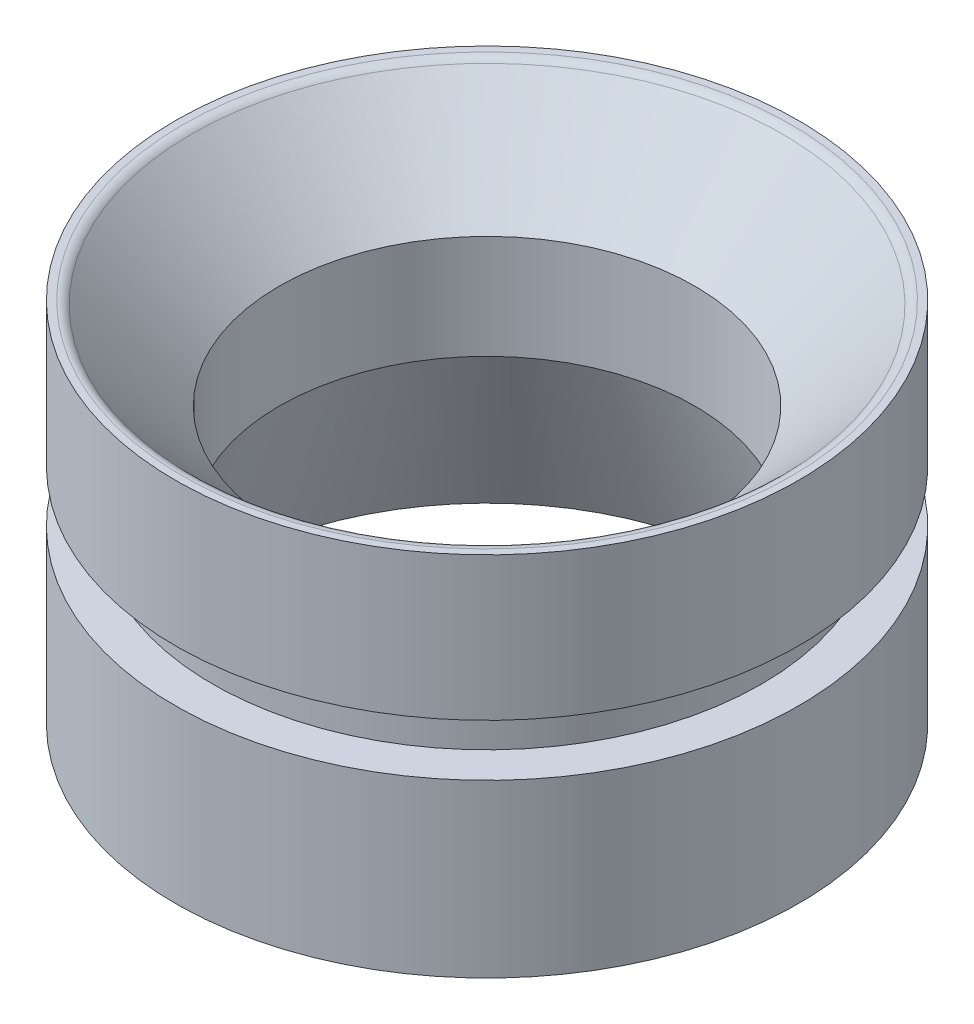
ISO-10303-21;
HEADER;
FILE_DESCRIPTION(('STEP AP214'),'2;1');
FILE_NAME('part.step','',(''),(''),'','','');
FILE_SCHEMA(('AUTOMOTIVE_DESIGN { 1 0 10303 214 1 1 1 1 }'));
ENDSEC;
DATA;
#1=APPLICATION_CONTEXT('core data for automotive mechanical design processes');
#2=APPLICATION_PROTOCOL_DEFINITION('international standard','automotive_design',2000,#1);
#3=PRODUCT_CONTEXT('',#1,'mechanical');
#4=PRODUCT('Part','Part','',(#3));
#5=PRODUCT_RELATED_PRODUCT_CATEGORY('part','',(#4));
#6=PRODUCT_DEFINITION_FORMATION('','',#4);
#7=PRODUCT_DEFINITION_CONTEXT('part definition',#1,'design');
#8=PRODUCT_DEFINITION('design','',#6,#7);
#9=PRODUCT_DEFINITION_SHAPE('','',#8);
#10=(LENGTH_UNIT() NAMED_UNIT(*) SI_UNIT(.MILLI.,.METRE.));
#11=(NAMED_UNIT(*) PLANE_ANGLE_UNIT() SI_UNIT($,.RADIAN.));
#12=(NAMED_UNIT(*) SI_UNIT($,.STERADIAN.) SOLID_ANGLE_UNIT());
#13=UNCERTAINTY_MEASURE_WITH_UNIT(LENGTH_MEASURE(1.E-05),#10,'distance_accuracy_value','');
#14=(GEOMETRIC_REPRESENTATION_CONTEXT(3) GLOBAL_UNCERTAINTY_ASSIGNED_CONTEXT((#13)) GLOBAL_UNIT_ASSIGNED_CONTEXT((#10,
#11,#12)) REPRESENTATION_CONTEXT('',''));
#15=CARTESIAN_POINT('',(0.,0.,0.));
#16=DIRECTION('',(0.,0.,1.));
#17=DIRECTION('',(1.,0.,0.));
#18=AXIS2_PLACEMENT_3D('',#15,#16,#17);
#19=CARTESIAN_POINT('',(0.,-3.175,0.));
#20=DIRECTION('',(0.,-1.,0.));
#21=DIRECTION('',(1.,0.,0.));
#22=AXIS2_PLACEMENT_3D('',#19,#20,#21);
#23=CONICAL_SURFACE('',#22,12.7,0.34906585039886);
#24=CARTESIAN_POINT('',(0.,-13.6428889681223,0.));
#25=DIRECTION('',(0.,1.,0.));
#26=DIRECTION('',(-1.,0.,0.));
#27=AXIS2_PLACEMENT_3D('',#24,#25,#26);
#28=CIRCLE('',#27,16.51);
#29=CARTESIAN_POINT('',(-16.51,-13.6428889681223,0.));
#30=VERTEX_POINT('',#29);
#31=EDGE_CURVE('E83',#30,#30,#28,.T.);
#32=ORIENTED_EDGE('',*,*,#31,.F.);
#33=EDGE_LOOP('',(#32));
#34=FACE_BOUND('',#33,.T.);
#35=CARTESIAN_POINT('',(0.,-3.175,0.));
#36=DIRECTION('',(0.,1.,0.));
#37=DIRECTION('',(-1.,0.,0.));
#38=AXIS2_PLACEMENT_3D('',#35,#36,#37);
#39=CIRCLE('',#38,12.7);
#40=CARTESIAN_POINT('',(-12.7,-3.175,0.));
#41=VERTEX_POINT('',#40);
#42=EDGE_CURVE('E50',#41,#41,#39,.T.);
#43=ORIENTED_EDGE('',*,*,#42,.T.);
#44=EDGE_LOOP('',(#43));
#45=FACE_BOUND('',#44,.T.);
#46=ADVANCED_FACE('F39',(#34,#45),#23,.F.);
#47=CARTESIAN_POINT('',(0.,44.7790796643202,0.));
#48=DIRECTION('',(0.,1.,0.));
#49=DIRECTION('',(-1.,0.,0.));
#50=AXIS2_PLACEMENT_3D('',#47,#48,#49);
#51=CYLINDRICAL_SURFACE('',#50,12.7);
#52=ORIENTED_EDGE('',*,*,#42,.F.);
#53=EDGE_LOOP('',(#52));
#54=FACE_BOUND('',#53,.T.);
#55=CARTESIAN_POINT('',(0.,3.175,0.));
#56=DIRECTION('',(0.,1.,0.));
#57=DIRECTION('',(-1.,0.,0.));
#58=AXIS2_PLACEMENT_3D('',#55,#56,#57);
#59=CIRCLE('',#58,12.7);
#60=CARTESIAN_POINT('',(-12.7,3.175,0.));
#61=VERTEX_POINT('',#60);
#62=EDGE_CURVE('E55',#61,#61,#59,.T.);
#63=ORIENTED_EDGE('',*,*,#62,.T.);
#64=EDGE_LOOP('',(#63));
#65=FACE_BOUND('',#64,.T.);
#66=ADVANCED_FACE('F91',(#54,#65),#51,.F.);
#67=CARTESIAN_POINT('',(0.,8.76300000000007,0.));
#68=DIRECTION('',(0.,1.,0.));
#69=DIRECTION('',(-1.,0.,0.));
#70=AXIS2_PLACEMENT_3D('',#67,#68,#69);
#71=CONICAL_SURFACE('',#70,18.288,0.785398163397443);
#72=CARTESIAN_POINT('',(0.,8.53981536726421,0.));
#73=DIRECTION('',(0.,-1.,0.));
#74=DIRECTION('',(1.,0.,0.));
#75=AXIS2_PLACEMENT_3D('',#72,#73,#74);
#76=CIRCLE('',#75,18.0648153672641);
#77=CARTESIAN_POINT('',(18.0648153672642,8.53981536726421,0.));
#78=VERTEX_POINT('',#77);
#79=EDGE_CURVE('E46',#78,#78,#76,.F.);
#80=ORIENTED_EDGE('',*,*,#79,.T.);
#81=EDGE_LOOP('',(#80));
#82=FACE_BOUND('',#81,.T.);
#83=ORIENTED_EDGE('',*,*,#62,.F.);
#84=EDGE_LOOP('',(#83));
#85=FACE_BOUND('',#84,.T.);
#86=ADVANCED_FACE('F96',(#82,#85),#71,.F.);
#87=CARTESIAN_POINT('',(18.288,8.76300000000007,0.));
#88=DIRECTION('',(0.,-1.,0.));
#89=DIRECTION('',(1.,0.,0.));
#90=AXIS2_PLACEMENT_3D('',#87,#88,#89);
#91=PLANE('',#90);
#92=CARTESIAN_POINT('',(0.,8.76300000000006,0.));
#93=DIRECTION('',(0.,-1.,0.));
#94=DIRECTION('',(1.,0.,0.));
#95=AXIS2_PLACEMENT_3D('',#92,#93,#94);
#96=CIRCLE('',#95,18.6036307345283);
#97=CARTESIAN_POINT('',(18.6036307345283,8.76300000000007,0.));
#98=VERTEX_POINT('',#97);
#99=EDGE_CURVE('E10',#98,#98,#96,.T.);
#100=ORIENTED_EDGE('',*,*,#99,.T.);
#101=EDGE_LOOP('',(#100));
#102=FACE_BOUND('',#101,.T.);
#103=CARTESIAN_POINT('',(0.,8.76300000000006,0.));
#104=DIRECTION('',(0.,1.,0.));
#105=DIRECTION('',(-1.,0.,0.));
#106=AXIS2_PLACEMENT_3D('',#103,#104,#105);
#107=CIRCLE('',#106,19.05);
#108=CARTESIAN_POINT('',(-19.05,8.76300000000006,0.));
#109=VERTEX_POINT('',#108);
#110=EDGE_CURVE('E61',#109,#109,#107,.T.);
#111=ORIENTED_EDGE('',*,*,#110,.T.);
#112=EDGE_LOOP('',(#111));
#113=FACE_BOUND('',#112,.T.);
#114=ADVANCED_FACE('F101',(#102,#113),#91,.F.);
#115=CARTESIAN_POINT('',(0.,44.7790796643202,0.));
#116=DIRECTION('',(0.,1.,0.));
#117=DIRECTION('',(-1.,0.,0.));
#118=AXIS2_PLACEMENT_3D('',#115,#116,#117);
#119=CYLINDRICAL_SURFACE('',#118,19.05);
#120=ORIENTED_EDGE('',*,*,#110,.F.);
#121=EDGE_LOOP('',(#120));
#122=FACE_BOUND('',#121,.T.);
#123=CARTESIAN_POINT('',(0.,0.,0.));
#124=DIRECTION('',(0.,1.,0.));
#125=DIRECTION('',(-1.,0.,0.));
#126=AXIS2_PLACEMENT_3D('',#123,#124,#125);
#127=CIRCLE('',#126,19.05);
#128=CARTESIAN_POINT('',(-19.05,0.,0.));
#129=VERTEX_POINT('',#128);
#130=EDGE_CURVE('E64',#129,#129,#127,.T.);
#131=ORIENTED_EDGE('',*,*,#130,.T.);
#132=EDGE_LOOP('',(#131));
#133=FACE_BOUND('',#132,.T.);
#134=ADVANCED_FACE('F107',(#122,#133),#119,.T.);
#135=CARTESIAN_POINT('',(19.05,0.,0.));
#136=DIRECTION('',(0.,1.,0.));
#137=DIRECTION('',(-1.,0.,0.));
#138=AXIS2_PLACEMENT_3D('',#135,#136,#137);
#139=PLANE('',#138);
#140=ORIENTED_EDGE('',*,*,#130,.F.);
#141=EDGE_LOOP('',(#140));
#142=FACE_BOUND('',#141,.T.);
#143=CARTESIAN_POINT('',(0.,0.,0.));
#144=DIRECTION('',(0.,1.,0.));
#145=DIRECTION('',(-1.,0.,0.));
#146=AXIS2_PLACEMENT_3D('',#143,#144,#145);
#147=CIRCLE('',#146,16.764);
#148=CARTESIAN_POINT('',(-16.764,0.,0.));
#149=VERTEX_POINT('',#148);
#150=EDGE_CURVE('E68',#149,#149,#147,.T.);
#151=ORIENTED_EDGE('',*,*,#150,.T.);
#152=EDGE_LOOP('',(#151));
#153=FACE_BOUND('',#152,.T.);
#154=ADVANCED_FACE('F112',(#142,#153),#139,.F.);
#155=CARTESIAN_POINT('',(0.,44.7790796643202,0.));
#156=DIRECTION('',(0.,1.,0.));
#157=DIRECTION('',(-1.,0.,0.));
#158=AXIS2_PLACEMENT_3D('',#155,#156,#157);
#159=CYLINDRICAL_SURFACE('',#158,16.764);
#160=ORIENTED_EDGE('',*,*,#150,.F.);
#161=EDGE_LOOP('',(#160));
#162=FACE_BOUND('',#161,.T.);
#163=CARTESIAN_POINT('',(0.,-3.175,0.));
#164=DIRECTION('',(0.,1.,0.));
#165=DIRECTION('',(-1.,0.,0.));
#166=AXIS2_PLACEMENT_3D('',#163,#164,#165);
#167=CIRCLE('',#166,16.764);
#168=CARTESIAN_POINT('',(-16.764,-3.175,0.));
#169=VERTEX_POINT('',#168);
#170=EDGE_CURVE('E72',#169,#169,#167,.T.);
#171=ORIENTED_EDGE('',*,*,#170,.T.);
#172=EDGE_LOOP('',(#171));
#173=FACE_BOUND('',#172,.T.);
#174=ADVANCED_FACE('F116',(#162,#173),#159,.T.);
#175=CARTESIAN_POINT('',(19.05,-3.175,0.));
#176=DIRECTION('',(0.,-1.,0.));
#177=DIRECTION('',(1.,0.,0.));
#178=AXIS2_PLACEMENT_3D('',#175,#176,#177);
#179=PLANE('',#178);
#180=ORIENTED_EDGE('',*,*,#170,.F.);
#181=EDGE_LOOP('',(#180));
#182=FACE_BOUND('',#181,.T.);
#183=CARTESIAN_POINT('',(0.,-3.175,0.));
#184=DIRECTION('',(0.,1.,0.));
#185=DIRECTION('',(-1.,0.,0.));
#186=AXIS2_PLACEMENT_3D('',#183,#184,#185);
#187=CIRCLE('',#186,19.05);
#188=CARTESIAN_POINT('',(-19.05,-3.175,0.));
#189=VERTEX_POINT('',#188);
#190=EDGE_CURVE('E76',#189,#189,#187,.T.);
#191=ORIENTED_EDGE('',*,*,#190,.T.);
#192=EDGE_LOOP('',(#191));
#193=FACE_BOUND('',#192,.T.);
#194=ADVANCED_FACE('F120',(#182,#193),#179,.F.);
#195=CARTESIAN_POINT('',(0.,44.7790796643202,0.));
#196=DIRECTION('',(0.,1.,0.));
#197=DIRECTION('',(-1.,0.,0.));
#198=AXIS2_PLACEMENT_3D('',#195,#196,#197);
#199=CYLINDRICAL_SURFACE('',#198,19.05);
#200=ORIENTED_EDGE('',*,*,#190,.F.);
#201=EDGE_LOOP('',(#200));
#202=FACE_BOUND('',#201,.T.);
#203=CARTESIAN_POINT('',(0.,-13.6428889681224,0.));
#204=DIRECTION('',(0.,1.,0.));
#205=DIRECTION('',(-1.,0.,0.));
#206=AXIS2_PLACEMENT_3D('',#203,#204,#205);
#207=CIRCLE('',#206,19.05);
#208=CARTESIAN_POINT('',(-19.05,-13.6428889681224,0.));
#209=VERTEX_POINT('',#208);
#210=EDGE_CURVE('E80',#209,#209,#207,.T.);
#211=ORIENTED_EDGE('',*,*,#210,.T.);
#212=EDGE_LOOP('',(#211));
#213=FACE_BOUND('',#212,.T.);
#214=ADVANCED_FACE('F124',(#202,#213),#199,.T.);
#215=CARTESIAN_POINT('',(19.05,-13.6428889681223,0.));
#216=DIRECTION('',(0.,1.,0.));
#217=DIRECTION('',(-1.,0.,0.));
#218=AXIS2_PLACEMENT_3D('',#215,#216,#217);
#219=PLANE('',#218);
#220=ORIENTED_EDGE('',*,*,#210,.F.);
#221=EDGE_LOOP('',(#220));
#222=FACE_BOUND('',#221,.T.);
#223=ORIENTED_EDGE('',*,*,#31,.T.);
#224=EDGE_LOOP('',(#223));
#225=FACE_BOUND('',#224,.T.);
#226=ADVANCED_FACE('F87',(#222,#225),#219,.F.);
#227=CARTESIAN_POINT('',(0.,8.00100000000006,0.));
#228=DIRECTION('',(0.,-1.,0.));
#229=DIRECTION('',(1.,0.,0.));
#230=AXIS2_PLACEMENT_3D('',#227,#228,#229);
#231=TOROIDAL_SURFACE('',#230,18.6036307345283,0.762);
#232=ORIENTED_EDGE('',*,*,#99,.F.);
#233=EDGE_LOOP('',(#232));
#234=FACE_BOUND('',#233,.T.);
#235=ORIENTED_EDGE('',*,*,#79,.F.);
#236=EDGE_LOOP('',(#235));
#237=FACE_BOUND('',#236,.T.);
#238=ADVANCED_FACE('F41',(#234,#237),#231,.T.);
#239=CLOSED_SHELL('',(#46,#66,#86,#114,#134,#154,#174,#194,#214,#226,#238));
#240=MANIFOLD_SOLID_BREP('B2',#239);
#241=ADVANCED_BREP_SHAPE_REPRESENTATION('',(#18,#240),#14);
#242=SHAPE_DEFINITION_REPRESENTATION(#9,#241);
ENDSEC;
END-ISO-10303-21;
